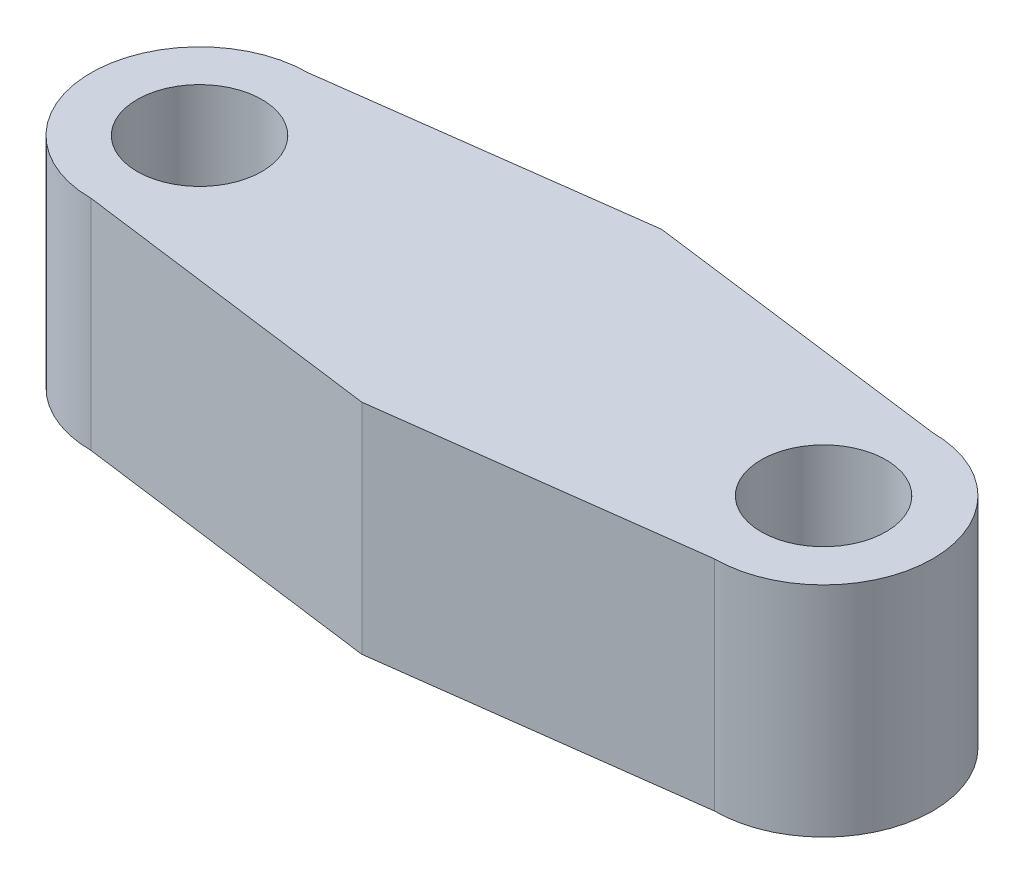
ISO-10303-21;
HEADER;
FILE_DESCRIPTION(('STEP AP214'),'2;1');
FILE_NAME('part.step','',(''),(''),'','','');
FILE_SCHEMA(('AUTOMOTIVE_DESIGN { 1 0 10303 214 1 1 1 1 }'));
ENDSEC;
DATA;
#1=APPLICATION_CONTEXT('core data for automotive mechanical design processes');
#2=APPLICATION_PROTOCOL_DEFINITION('international standard','automotive_design',2000,#1);
#3=PRODUCT_CONTEXT('',#1,'mechanical');
#4=PRODUCT('Part','Part','',(#3));
#5=PRODUCT_RELATED_PRODUCT_CATEGORY('part','',(#4));
#6=PRODUCT_DEFINITION_FORMATION('','',#4);
#7=PRODUCT_DEFINITION_CONTEXT('part definition',#1,'design');
#8=PRODUCT_DEFINITION('design','',#6,#7);
#9=PRODUCT_DEFINITION_SHAPE('','',#8);
#10=(LENGTH_UNIT() NAMED_UNIT(*) SI_UNIT(.MILLI.,.METRE.));
#11=(NAMED_UNIT(*) PLANE_ANGLE_UNIT() SI_UNIT($,.RADIAN.));
#12=(NAMED_UNIT(*) SI_UNIT($,.STERADIAN.) SOLID_ANGLE_UNIT());
#13=UNCERTAINTY_MEASURE_WITH_UNIT(LENGTH_MEASURE(1.E-05),#10,'distance_accuracy_value','');
#14=(GEOMETRIC_REPRESENTATION_CONTEXT(3) GLOBAL_UNCERTAINTY_ASSIGNED_CONTEXT((#13)) GLOBAL_UNIT_ASSIGNED_CONTEXT((#10,
#11,#12)) REPRESENTATION_CONTEXT('',''));
#15=CARTESIAN_POINT('',(0.,0.,0.));
#16=DIRECTION('',(0.,0.,1.));
#17=DIRECTION('',(1.,0.,0.));
#18=AXIS2_PLACEMENT_3D('',#15,#16,#17);
#19=CARTESIAN_POINT('',(-0.311066246500899,3.5,-2.35898135890438));
#20=DIRECTION('',(0.130732935622622,0.,0.991417621158456));
#21=DIRECTION('',(0.991417621158456,0.,-0.130732935622622));
#22=AXIS2_PLACEMENT_3D('',#19,#20,#21);
#23=PLANE('',#22);
#24=DIRECTION('',(-0.991417621158456,0.,0.130732935622622));
#25=VECTOR('',#24,1.);
#26=CARTESIAN_POINT('',(-0.311066246500899,0.,-2.35898135890438));
#27=LINE('',#26,#25);
#28=CARTESIAN_POINT('',(0.,0.,-2.4));
#29=VERTEX_POINT('',#28);
#30=CARTESIAN_POINT('',(-5.,0.,-1.74067676006271));
#31=VERTEX_POINT('',#30);
#32=EDGE_CURVE('E141',#29,#31,#27,.T.);
#33=ORIENTED_EDGE('',*,*,#32,.T.);
#34=DIRECTION('',(0.,-1.,0.));
#35=VECTOR('',#34,1.);
#36=CARTESIAN_POINT('',(-5.,3.5,-1.74067676006271));
#37=LINE('',#36,#35);
#38=CARTESIAN_POINT('',(-5.,3.5,-1.74067676006271));
#39=VERTEX_POINT('',#38);
#40=EDGE_CURVE('E11',#39,#31,#37,.T.);
#41=ORIENTED_EDGE('',*,*,#40,.F.);
#42=DIRECTION('',(-0.991417621158456,0.,0.130732935622622));
#43=VECTOR('',#42,1.);
#44=CARTESIAN_POINT('',(-0.311066246500899,3.5,-2.35898135890438));
#45=LINE('',#44,#43);
#46=CARTESIAN_POINT('',(0.,3.5,-2.4));
#47=VERTEX_POINT('',#46);
#48=EDGE_CURVE('E269',#47,#39,#45,.T.);
#49=ORIENTED_EDGE('',*,*,#48,.F.);
#50=DIRECTION('',(0.,-1.,0.));
#51=VECTOR('',#50,1.);
#52=CARTESIAN_POINT('',(0.,3.5,-2.4));
#53=LINE('',#52,#51);
#54=EDGE_CURVE('E61',#47,#29,#53,.T.);
#55=ORIENTED_EDGE('',*,*,#54,.T.);
#56=EDGE_LOOP('',(#33,#41,#49,#55));
#57=FACE_BOUND('',#56,.T.);
#58=ADVANCED_FACE('F43',(#57),#23,.F.);
#59=CARTESIAN_POINT('',(-5.,3.5,0.));
#60=DIRECTION('',(0.,-1.,0.));
#61=DIRECTION('',(0.,0.,-1.));
#62=AXIS2_PLACEMENT_3D('',#59,#60,#61);
#63=CYLINDRICAL_SURFACE('',#62,1.74067676006271);
#64=CARTESIAN_POINT('',(-5.,0.,0.));
#65=DIRECTION('',(0.,1.,0.));
#66=DIRECTION('',(0.,0.,1.));
#67=AXIS2_PLACEMENT_3D('',#64,#65,#66);
#68=CIRCLE('',#67,1.74067676006271);
#69=CARTESIAN_POINT('',(-5.,0.,1.74067676006271));
#70=VERTEX_POINT('',#69);
#71=EDGE_CURVE('E144',#31,#70,#68,.T.);
#72=ORIENTED_EDGE('',*,*,#71,.T.);
#73=DIRECTION('',(0.,-1.,0.));
#74=VECTOR('',#73,1.);
#75=CARTESIAN_POINT('',(-5.,3.5,1.74067676006271));
#76=LINE('',#75,#74);
#77=CARTESIAN_POINT('',(-5.,3.5,1.74067676006271));
#78=VERTEX_POINT('',#77);
#79=EDGE_CURVE('E53',#78,#70,#76,.T.);
#80=ORIENTED_EDGE('',*,*,#79,.F.);
#81=CARTESIAN_POINT('',(-5.,3.5,0.));
#82=DIRECTION('',(0.,1.,0.));
#83=DIRECTION('',(0.,0.,1.));
#84=AXIS2_PLACEMENT_3D('',#81,#82,#83);
#85=CIRCLE('',#84,1.74067676006271);
#86=EDGE_CURVE('E94',#39,#78,#85,.T.);
#87=ORIENTED_EDGE('',*,*,#86,.F.);
#88=ORIENTED_EDGE('',*,*,#40,.T.);
#89=EDGE_LOOP('',(#72,#80,#87,#88));
#90=FACE_BOUND('',#89,.T.);
#91=ADVANCED_FACE('F171',(#90),#63,.T.);
#92=CARTESIAN_POINT('',(-0.311066246500899,3.5,2.35898135890438));
#93=DIRECTION('',(-0.130732935622622,0.,0.991417621158456));
#94=DIRECTION('',(0.991417621158456,0.,0.130732935622622));
#95=AXIS2_PLACEMENT_3D('',#92,#93,#94);
#96=PLANE('',#95);
#97=DIRECTION('',(-0.991417621158456,0.,-0.130732935622622));
#98=VECTOR('',#97,1.);
#99=CARTESIAN_POINT('',(-0.311066246500899,0.,2.35898135890438));
#100=LINE('',#99,#98);
#101=CARTESIAN_POINT('',(0.,0.,2.4));
#102=VERTEX_POINT('',#101);
#103=EDGE_CURVE('E148',#102,#70,#100,.T.);
#104=ORIENTED_EDGE('',*,*,#103,.F.);
#105=DIRECTION('',(0.,-1.,0.));
#106=VECTOR('',#105,1.);
#107=CARTESIAN_POINT('',(0.,3.5,2.4));
#108=LINE('',#107,#106);
#109=CARTESIAN_POINT('',(0.,3.5,2.4));
#110=VERTEX_POINT('',#109);
#111=EDGE_CURVE('E123',#110,#102,#108,.T.);
#112=ORIENTED_EDGE('',*,*,#111,.F.);
#113=DIRECTION('',(-0.991417621158456,0.,-0.130732935622622));
#114=VECTOR('',#113,1.);
#115=CARTESIAN_POINT('',(-0.311066246500899,3.5,2.35898135890438));
#116=LINE('',#115,#114);
#117=EDGE_CURVE('E111',#110,#78,#116,.T.);
#118=ORIENTED_EDGE('',*,*,#117,.T.);
#119=ORIENTED_EDGE('',*,*,#79,.T.);
#120=EDGE_LOOP('',(#104,#112,#118,#119));
#121=FACE_BOUND('',#120,.T.);
#122=ADVANCED_FACE('F170',(#121),#96,.T.);
#123=CARTESIAN_POINT('',(0.306953612865915,3.5,2.36007735929487));
#124=DIRECTION('',(-0.128974546431213,0.,-0.991647904436279));
#125=DIRECTION('',(-0.991647904436279,0.,0.128974546431213));
#126=AXIS2_PLACEMENT_3D('',#123,#124,#125);
#127=PLANE('',#126);
#128=DIRECTION('',(0.991647904436279,0.,-0.128974546431213));
#129=VECTOR('',#128,1.);
#130=CARTESIAN_POINT('',(0.306953612865915,0.,2.36007735929487));
#131=LINE('',#130,#129);
#132=CARTESIAN_POINT('',(5.,0.,1.74969586556767));
#133=VERTEX_POINT('',#132);
#134=EDGE_CURVE('E119',#102,#133,#131,.T.);
#135=ORIENTED_EDGE('',*,*,#134,.T.);
#136=DIRECTION('',(0.,-1.,0.));
#137=VECTOR('',#136,1.);
#138=CARTESIAN_POINT('',(5.,3.5,1.74969586556767));
#139=LINE('',#138,#137);
#140=CARTESIAN_POINT('',(5.,3.5,1.74969586556767));
#141=VERTEX_POINT('',#140);
#142=EDGE_CURVE('E116',#141,#133,#139,.T.);
#143=ORIENTED_EDGE('',*,*,#142,.F.);
#144=DIRECTION('',(0.991647904436279,0.,-0.128974546431213));
#145=VECTOR('',#144,1.);
#146=CARTESIAN_POINT('',(0.306953612865915,3.5,2.36007735929487));
#147=LINE('',#146,#145);
#148=EDGE_CURVE('E104',#110,#141,#147,.T.);
#149=ORIENTED_EDGE('',*,*,#148,.F.);
#150=ORIENTED_EDGE('',*,*,#111,.T.);
#151=EDGE_LOOP('',(#135,#143,#149,#150));
#152=FACE_BOUND('',#151,.T.);
#153=ADVANCED_FACE('F117',(#152),#127,.F.);
#154=CARTESIAN_POINT('',(5.,3.5,0.));
#155=DIRECTION('',(0.,-1.,0.));
#156=DIRECTION('',(0.,0.,-1.));
#157=AXIS2_PLACEMENT_3D('',#154,#155,#156);
#158=CYLINDRICAL_SURFACE('',#157,1.74969586556767);
#159=CARTESIAN_POINT('',(5.,0.,0.));
#160=DIRECTION('',(0.,1.,0.));
#161=DIRECTION('',(0.,0.,1.));
#162=AXIS2_PLACEMENT_3D('',#159,#160,#161);
#163=CIRCLE('',#162,1.74969586556767);
#164=CARTESIAN_POINT('',(5.,0.,-1.74969586556767));
#165=VERTEX_POINT('',#164);
#166=EDGE_CURVE('E154',#133,#165,#163,.T.);
#167=ORIENTED_EDGE('',*,*,#166,.T.);
#168=DIRECTION('',(0.,-1.,0.));
#169=VECTOR('',#168,1.);
#170=CARTESIAN_POINT('',(5.,3.5,-1.74969586556767));
#171=LINE('',#170,#169);
#172=CARTESIAN_POINT('',(5.,3.5,-1.74969586556767));
#173=VERTEX_POINT('',#172);
#174=EDGE_CURVE('E82',#173,#165,#171,.T.);
#175=ORIENTED_EDGE('',*,*,#174,.F.);
#176=CARTESIAN_POINT('',(5.,3.5,0.));
#177=DIRECTION('',(0.,1.,0.));
#178=DIRECTION('',(0.,0.,1.));
#179=AXIS2_PLACEMENT_3D('',#176,#177,#178);
#180=CIRCLE('',#179,1.74969586556767);
#181=EDGE_CURVE('E109',#141,#173,#180,.T.);
#182=ORIENTED_EDGE('',*,*,#181,.F.);
#183=ORIENTED_EDGE('',*,*,#142,.T.);
#184=EDGE_LOOP('',(#167,#175,#182,#183));
#185=FACE_BOUND('',#184,.T.);
#186=ADVANCED_FACE('F125',(#185),#158,.T.);
#187=CARTESIAN_POINT('',(5.,3.5,0.));
#188=DIRECTION('',(0.,-1.,0.));
#189=DIRECTION('',(0.,0.,-1.));
#190=AXIS2_PLACEMENT_3D('',#187,#188,#189);
#191=CYLINDRICAL_SURFACE('',#190,1.);
#192=CARTESIAN_POINT('',(5.,3.5,0.));
#193=DIRECTION('',(0.,1.,0.));
#194=DIRECTION('',(0.,0.,1.));
#195=AXIS2_PLACEMENT_3D('',#192,#193,#194);
#196=CIRCLE('',#195,1.);
#197=CARTESIAN_POINT('',(5.,3.5,1.));
#198=VERTEX_POINT('',#197);
#199=EDGE_CURVE('E203',#198,#198,#196,.T.);
#200=ORIENTED_EDGE('',*,*,#199,.T.);
#201=EDGE_LOOP('',(#200));
#202=FACE_BOUND('',#201,.T.);
#203=CARTESIAN_POINT('',(5.,0.,0.));
#204=DIRECTION('',(0.,1.,0.));
#205=DIRECTION('',(0.,0.,1.));
#206=AXIS2_PLACEMENT_3D('',#203,#204,#205);
#207=CIRCLE('',#206,1.);
#208=CARTESIAN_POINT('',(5.,0.,1.));
#209=VERTEX_POINT('',#208);
#210=EDGE_CURVE('E137',#209,#209,#207,.T.);
#211=ORIENTED_EDGE('',*,*,#210,.F.);
#212=EDGE_LOOP('',(#211));
#213=FACE_BOUND('',#212,.T.);
#214=ADVANCED_FACE('F184',(#202,#213),#191,.F.);
#215=CARTESIAN_POINT('',(-5.,3.5,0.));
#216=DIRECTION('',(0.,-1.,0.));
#217=DIRECTION('',(0.,0.,-1.));
#218=AXIS2_PLACEMENT_3D('',#215,#216,#217);
#219=CYLINDRICAL_SURFACE('',#218,1.);
#220=CARTESIAN_POINT('',(-5.,3.5,0.));
#221=DIRECTION('',(0.,1.,0.));
#222=DIRECTION('',(0.,0.,1.));
#223=AXIS2_PLACEMENT_3D('',#220,#221,#222);
#224=CIRCLE('',#223,1.);
#225=CARTESIAN_POINT('',(-5.,3.5,1.));
#226=VERTEX_POINT('',#225);
#227=EDGE_CURVE('E161',#226,#226,#224,.T.);
#228=ORIENTED_EDGE('',*,*,#227,.T.);
#229=EDGE_LOOP('',(#228));
#230=FACE_BOUND('',#229,.T.);
#231=CARTESIAN_POINT('',(-5.,0.,0.));
#232=DIRECTION('',(0.,1.,0.));
#233=DIRECTION('',(0.,0.,1.));
#234=AXIS2_PLACEMENT_3D('',#231,#232,#233);
#235=CIRCLE('',#234,1.);
#236=CARTESIAN_POINT('',(-5.,0.,1.));
#237=VERTEX_POINT('',#236);
#238=EDGE_CURVE('E133',#237,#237,#235,.T.);
#239=ORIENTED_EDGE('',*,*,#238,.F.);
#240=EDGE_LOOP('',(#239));
#241=FACE_BOUND('',#240,.T.);
#242=ADVANCED_FACE('F45',(#230,#241),#219,.F.);
#243=CARTESIAN_POINT('',(0.306953612865915,3.5,-2.36007735929487));
#244=DIRECTION('',(0.128974546431213,0.,-0.991647904436279));
#245=DIRECTION('',(-0.991647904436279,0.,-0.128974546431213));
#246=AXIS2_PLACEMENT_3D('',#243,#244,#245);
#247=PLANE('',#246);
#248=DIRECTION('',(0.991647904436279,0.,0.128974546431213));
#249=VECTOR('',#248,1.);
#250=CARTESIAN_POINT('',(0.306953612865915,0.,-2.36007735929487));
#251=LINE('',#250,#249);
#252=EDGE_CURVE('E157',#29,#165,#251,.T.);
#253=ORIENTED_EDGE('',*,*,#252,.F.);
#254=ORIENTED_EDGE('',*,*,#54,.F.);
#255=DIRECTION('',(0.991647904436279,0.,0.128974546431213));
#256=VECTOR('',#255,1.);
#257=CARTESIAN_POINT('',(0.306953612865915,3.5,-2.36007735929487));
#258=LINE('',#257,#256);
#259=EDGE_CURVE('E127',#47,#173,#258,.T.);
#260=ORIENTED_EDGE('',*,*,#259,.T.);
#261=ORIENTED_EDGE('',*,*,#174,.T.);
#262=EDGE_LOOP('',(#253,#254,#260,#261));
#263=FACE_BOUND('',#262,.T.);
#264=ADVANCED_FACE('F175',(#263),#247,.T.);
#265=CARTESIAN_POINT('',(0.,3.5,0.));
#266=DIRECTION('',(0.,1.,0.));
#267=DIRECTION('',(0.,0.,1.));
#268=AXIS2_PLACEMENT_3D('',#265,#266,#267);
#269=PLANE('',#268);
#270=ORIENTED_EDGE('',*,*,#227,.F.);
#271=EDGE_LOOP('',(#270));
#272=FACE_BOUND('',#271,.T.);
#273=ORIENTED_EDGE('',*,*,#199,.F.);
#274=EDGE_LOOP('',(#273));
#275=FACE_BOUND('',#274,.T.);
#276=ORIENTED_EDGE('',*,*,#48,.T.);
#277=ORIENTED_EDGE('',*,*,#86,.T.);
#278=ORIENTED_EDGE('',*,*,#117,.F.);
#279=ORIENTED_EDGE('',*,*,#148,.T.);
#280=ORIENTED_EDGE('',*,*,#181,.T.);
#281=ORIENTED_EDGE('',*,*,#259,.F.);
#282=EDGE_LOOP('',(#276,#277,#278,#279,#280,#281));
#283=FACE_BOUND('',#282,.T.);
#284=ADVANCED_FACE('F106',(#272,#275,#283),#269,.T.);
#285=CARTESIAN_POINT('',(0.,0.,0.));
#286=DIRECTION('',(0.,1.,0.));
#287=DIRECTION('',(0.,0.,1.));
#288=AXIS2_PLACEMENT_3D('',#285,#286,#287);
#289=PLANE('',#288);
#290=ORIENTED_EDGE('',*,*,#238,.T.);
#291=EDGE_LOOP('',(#290));
#292=FACE_BOUND('',#291,.T.);
#293=ORIENTED_EDGE('',*,*,#210,.T.);
#294=EDGE_LOOP('',(#293));
#295=FACE_BOUND('',#294,.T.);
#296=ORIENTED_EDGE('',*,*,#32,.F.);
#297=ORIENTED_EDGE('',*,*,#252,.T.);
#298=ORIENTED_EDGE('',*,*,#166,.F.);
#299=ORIENTED_EDGE('',*,*,#134,.F.);
#300=ORIENTED_EDGE('',*,*,#103,.T.);
#301=ORIENTED_EDGE('',*,*,#71,.F.);
#302=EDGE_LOOP('',(#296,#297,#298,#299,#300,#301));
#303=FACE_BOUND('',#302,.T.);
#304=ADVANCED_FACE('F174',(#292,#295,#303),#289,.F.);
#305=CLOSED_SHELL('',(#58,#91,#122,#153,#186,#214,#242,#264,#284,#304));
#306=MANIFOLD_SOLID_BREP('B2',#305);
#307=ADVANCED_BREP_SHAPE_REPRESENTATION('',(#18,#306),#14);
#308=SHAPE_DEFINITION_REPRESENTATION(#9,#307);
ENDSEC;
END-ISO-10303-21;
